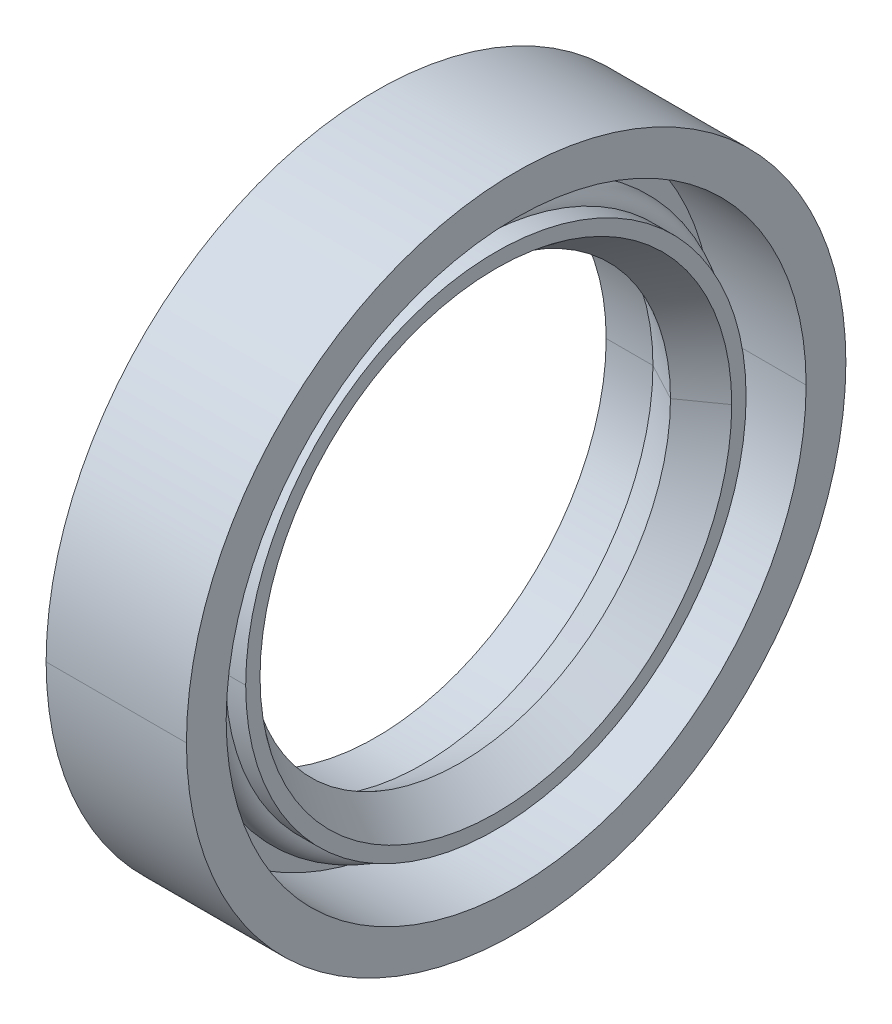
ISO-10303-21;
HEADER;
FILE_DESCRIPTION(('STEP AP214'),'2;1');
FILE_NAME('part.step','',(''),(''),'','','');
FILE_SCHEMA(('AUTOMOTIVE_DESIGN { 1 0 10303 214 1 1 1 1 }'));
ENDSEC;
DATA;
#1=APPLICATION_CONTEXT('core data for automotive mechanical design processes');
#2=APPLICATION_PROTOCOL_DEFINITION('international standard','automotive_design',2000,#1);
#3=PRODUCT_CONTEXT('',#1,'mechanical');
#4=PRODUCT('Part','Part','',(#3));
#5=PRODUCT_RELATED_PRODUCT_CATEGORY('part','',(#4));
#6=PRODUCT_DEFINITION_FORMATION('','',#4);
#7=PRODUCT_DEFINITION_CONTEXT('part definition',#1,'design');
#8=PRODUCT_DEFINITION('design','',#6,#7);
#9=PRODUCT_DEFINITION_SHAPE('','',#8);
#10=(LENGTH_UNIT() NAMED_UNIT(*) SI_UNIT(.MILLI.,.METRE.));
#11=(NAMED_UNIT(*) PLANE_ANGLE_UNIT() SI_UNIT($,.RADIAN.));
#12=(NAMED_UNIT(*) SI_UNIT($,.STERADIAN.) SOLID_ANGLE_UNIT());
#13=UNCERTAINTY_MEASURE_WITH_UNIT(LENGTH_MEASURE(1.E-05),#10,'distance_accuracy_value','');
#14=(GEOMETRIC_REPRESENTATION_CONTEXT(3) GLOBAL_UNCERTAINTY_ASSIGNED_CONTEXT((#13)) GLOBAL_UNIT_ASSIGNED_CONTEXT((#10,
#11,#12)) REPRESENTATION_CONTEXT('',''));
#15=CARTESIAN_POINT('',(0.,0.,0.));
#16=DIRECTION('',(0.,0.,1.));
#17=DIRECTION('',(1.,0.,0.));
#18=AXIS2_PLACEMENT_3D('',#15,#16,#17);
#19=CARTESIAN_POINT('',(10.,0.,0.));
#20=DIRECTION('',(1.,0.,0.));
#21=DIRECTION('',(0.,1.,0.));
#22=AXIS2_PLACEMENT_3D('',#19,#20,#21);
#23=CYLINDRICAL_SURFACE('',#22,23.5);
#24=DIRECTION('',(1.,0.,0.));
#25=VECTOR('',#24,1.);
#26=CARTESIAN_POINT('',(0.,0.,23.5));
#27=LINE('',#26,#25);
#28=CARTESIAN_POINT('',(0.,0.,23.5));
#29=VERTEX_POINT('',#28);
#30=CARTESIAN_POINT('',(10.,0.,23.5));
#31=VERTEX_POINT('',#30);
#32=EDGE_CURVE('E11',#29,#31,#27,.T.);
#33=ORIENTED_EDGE('',*,*,#32,.F.);
#34=CARTESIAN_POINT('',(0.,0.,0.));
#35=DIRECTION('',(1.,0.,0.));
#36=DIRECTION('',(0.,0.,-1.));
#37=AXIS2_PLACEMENT_3D('',#34,#35,#36);
#38=CIRCLE('',#37,23.5);
#39=CARTESIAN_POINT('',(0.,0.,-23.5));
#40=VERTEX_POINT('',#39);
#41=EDGE_CURVE('E25',#29,#40,#38,.T.);
#42=ORIENTED_EDGE('',*,*,#41,.T.);
#43=DIRECTION('',(1.,0.,0.));
#44=VECTOR('',#43,1.);
#45=CARTESIAN_POINT('',(0.,0.,-23.5));
#46=LINE('',#45,#44);
#47=CARTESIAN_POINT('',(10.,0.,-23.5));
#48=VERTEX_POINT('',#47);
#49=EDGE_CURVE('E320',#40,#48,#46,.T.);
#50=ORIENTED_EDGE('',*,*,#49,.T.);
#51=CARTESIAN_POINT('',(10.,0.,0.));
#52=DIRECTION('',(1.,0.,0.));
#53=DIRECTION('',(0.,0.,-1.));
#54=AXIS2_PLACEMENT_3D('',#51,#52,#53);
#55=CIRCLE('',#54,23.5);
#56=EDGE_CURVE('E315',#31,#48,#55,.T.);
#57=ORIENTED_EDGE('',*,*,#56,.F.);
#58=EDGE_LOOP('',(#33,#42,#50,#57));
#59=FACE_BOUND('',#58,.T.);
#60=ADVANCED_FACE('F17',(#59),#23,.T.);
#61=CARTESIAN_POINT('',(10.,20.666666666667,0.));
#62=DIRECTION('',(1.,0.,0.));
#63=DIRECTION('',(0.,0.,-1.));
#64=AXIS2_PLACEMENT_3D('',#61,#62,#63);
#65=PLANE('',#64);
#66=CARTESIAN_POINT('',(10.,0.,0.));
#67=DIRECTION('',(1.,0.,0.));
#68=DIRECTION('',(0.,0.,-1.));
#69=AXIS2_PLACEMENT_3D('',#66,#67,#68);
#70=CIRCLE('',#69,23.5);
#71=EDGE_CURVE('E310',#48,#31,#70,.T.);
#72=ORIENTED_EDGE('',*,*,#71,.T.);
#73=ORIENTED_EDGE('',*,*,#56,.T.);
#74=EDGE_LOOP('',(#72,#73));
#75=FACE_BOUND('',#74,.T.);
#76=CARTESIAN_POINT('',(10.,0.,0.));
#77=DIRECTION('',(1.,0.,0.));
#78=DIRECTION('',(0.,0.,-1.));
#79=AXIS2_PLACEMENT_3D('',#76,#77,#78);
#80=CIRCLE('',#79,20.666666666667);
#81=CARTESIAN_POINT('',(10.,0.,20.666666666667));
#82=VERTEX_POINT('',#81);
#83=CARTESIAN_POINT('',(10.,0.,-20.666666666667));
#84=VERTEX_POINT('',#83);
#85=EDGE_CURVE('E305',#82,#84,#80,.T.);
#86=ORIENTED_EDGE('',*,*,#85,.F.);
#87=CARTESIAN_POINT('',(10.,0.,0.));
#88=DIRECTION('',(1.,0.,0.));
#89=DIRECTION('',(0.,0.,-1.));
#90=AXIS2_PLACEMENT_3D('',#87,#88,#89);
#91=CIRCLE('',#90,20.666666666667);
#92=EDGE_CURVE('E300',#84,#82,#91,.T.);
#93=ORIENTED_EDGE('',*,*,#92,.F.);
#94=EDGE_LOOP('',(#86,#93));
#95=FACE_BOUND('',#94,.T.);
#96=ADVANCED_FACE('F333',(#75,#95),#65,.T.);
#97=CARTESIAN_POINT('',(10.,0.,0.));
#98=DIRECTION('',(1.,0.,0.));
#99=DIRECTION('',(0.,-1.,0.));
#100=AXIS2_PLACEMENT_3D('',#97,#98,#99);
#101=CYLINDRICAL_SURFACE('',#100,20.666666666667);
#102=DIRECTION('',(1.,0.,0.));
#103=VECTOR('',#102,1.);
#104=CARTESIAN_POINT('',(3.3333333333333,0.,20.666666666667));
#105=LINE('',#104,#103);
#106=CARTESIAN_POINT('',(3.3333333333333,0.,20.666666666667));
#107=VERTEX_POINT('',#106);
#108=EDGE_CURVE('E295',#107,#82,#105,.T.);
#109=ORIENTED_EDGE('',*,*,#108,.F.);
#110=CARTESIAN_POINT('',(3.3333333333333,0.,0.));
#111=DIRECTION('',(1.,0.,0.));
#112=DIRECTION('',(0.,0.,-1.));
#113=AXIS2_PLACEMENT_3D('',#110,#111,#112);
#114=CIRCLE('',#113,20.666666666667);
#115=CARTESIAN_POINT('',(3.3333333333333,0.,-20.666666666667));
#116=VERTEX_POINT('',#115);
#117=EDGE_CURVE('E290',#116,#107,#114,.T.);
#118=ORIENTED_EDGE('',*,*,#117,.F.);
#119=DIRECTION('',(1.,0.,0.));
#120=VECTOR('',#119,1.);
#121=CARTESIAN_POINT('',(3.3333333333333,0.,-20.666666666667));
#122=LINE('',#121,#120);
#123=EDGE_CURVE('E285',#116,#84,#122,.T.);
#124=ORIENTED_EDGE('',*,*,#123,.T.);
#125=ORIENTED_EDGE('',*,*,#92,.T.);
#126=EDGE_LOOP('',(#109,#118,#124,#125));
#127=FACE_BOUND('',#126,.T.);
#128=ADVANCED_FACE('F336',(#127),#101,.F.);
#129=CARTESIAN_POINT('',(10.,0.,0.));
#130=DIRECTION('',(1.,0.,0.));
#131=DIRECTION('',(0.,1.,0.));
#132=AXIS2_PLACEMENT_3D('',#129,#130,#131);
#133=CYLINDRICAL_SURFACE('',#132,20.666666666667);
#134=ORIENTED_EDGE('',*,*,#108,.T.);
#135=ORIENTED_EDGE('',*,*,#85,.T.);
#136=ORIENTED_EDGE('',*,*,#123,.F.);
#137=CARTESIAN_POINT('',(3.3333333333333,0.,0.));
#138=DIRECTION('',(1.,0.,0.));
#139=DIRECTION('',(0.,0.,-1.));
#140=AXIS2_PLACEMENT_3D('',#137,#138,#139);
#141=CIRCLE('',#140,20.666666666667);
#142=EDGE_CURVE('E280',#107,#116,#141,.T.);
#143=ORIENTED_EDGE('',*,*,#142,.F.);
#144=EDGE_LOOP('',(#134,#135,#136,#143));
#145=FACE_BOUND('',#144,.T.);
#146=ADVANCED_FACE('F340',(#145),#133,.F.);
#147=CARTESIAN_POINT('',(3.3333333333333,17.833333333333,0.));
#148=DIRECTION('',(1.,0.,0.));
#149=DIRECTION('',(0.,0.,-1.));
#150=AXIS2_PLACEMENT_3D('',#147,#148,#149);
#151=PLANE('',#150);
#152=ORIENTED_EDGE('',*,*,#117,.T.);
#153=ORIENTED_EDGE('',*,*,#142,.T.);
#154=EDGE_LOOP('',(#152,#153));
#155=FACE_BOUND('',#154,.T.);
#156=CARTESIAN_POINT('',(3.3333333333333,0.,0.));
#157=DIRECTION('',(1.,0.,0.));
#158=DIRECTION('',(0.,0.,-1.));
#159=AXIS2_PLACEMENT_3D('',#156,#157,#158);
#160=CIRCLE('',#159,17.833333333333);
#161=CARTESIAN_POINT('',(3.3333333333333,0.,17.833333333333));
#162=VERTEX_POINT('',#161);
#163=CARTESIAN_POINT('',(3.3333333333333,0.,-17.833333333333));
#164=VERTEX_POINT('',#163);
#165=EDGE_CURVE('E275',#162,#164,#160,.T.);
#166=ORIENTED_EDGE('',*,*,#165,.F.);
#167=CARTESIAN_POINT('',(3.3333333333333,0.,0.));
#168=DIRECTION('',(1.,0.,0.));
#169=DIRECTION('',(0.,0.,-1.));
#170=AXIS2_PLACEMENT_3D('',#167,#168,#169);
#171=CIRCLE('',#170,17.833333333333);
#172=EDGE_CURVE('E270',#164,#162,#171,.T.);
#173=ORIENTED_EDGE('',*,*,#172,.F.);
#174=EDGE_LOOP('',(#166,#173));
#175=FACE_BOUND('',#174,.T.);
#176=ADVANCED_FACE('F343',(#155,#175),#151,.T.);
#177=CARTESIAN_POINT('',(10.,0.,0.));
#178=DIRECTION('',(1.,0.,0.));
#179=DIRECTION('',(0.,-1.,0.));
#180=AXIS2_PLACEMENT_3D('',#177,#178,#179);
#181=CYLINDRICAL_SURFACE('',#180,17.833333333333);
#182=DIRECTION('',(1.,0.,0.));
#183=VECTOR('',#182,1.);
#184=CARTESIAN_POINT('',(3.3333333333333,0.,17.833333333333));
#185=LINE('',#184,#183);
#186=CARTESIAN_POINT('',(4.888889,0.,17.833333333333));
#187=VERTEX_POINT('',#186);
#188=EDGE_CURVE('E266',#162,#187,#185,.T.);
#189=ORIENTED_EDGE('',*,*,#188,.T.);
#190=CARTESIAN_POINT('',(4.888889,0.,0.));
#191=DIRECTION('',(1.,0.,0.));
#192=DIRECTION('',(0.,0.,-1.));
#193=AXIS2_PLACEMENT_3D('',#190,#191,#192);
#194=CIRCLE('',#193,17.833333333333);
#195=CARTESIAN_POINT('',(4.888889,16.9605078739299,5.51080306635312));
#196=VERTEX_POINT('',#195);
#197=EDGE_CURVE('E261',#196,#187,#194,.T.);
#198=ORIENTED_EDGE('',*,*,#197,.F.);
#199=CARTESIAN_POINT('',(4.888889,0.,0.));
#200=DIRECTION('',(1.,0.,0.));
#201=DIRECTION('',(0.,0.,-1.));
#202=AXIS2_PLACEMENT_3D('',#199,#200,#201);
#203=CIRCLE('',#202,17.833333333333);
#204=CARTESIAN_POINT('',(4.888889,0.,-17.833333333333));
#205=VERTEX_POINT('',#204);
#206=EDGE_CURVE('E256',#205,#196,#203,.T.);
#207=ORIENTED_EDGE('',*,*,#206,.F.);
#208=DIRECTION('',(1.,0.,0.));
#209=VECTOR('',#208,1.);
#210=CARTESIAN_POINT('',(3.3333333333333,0.,-17.833333333333));
#211=LINE('',#210,#209);
#212=EDGE_CURVE('E251',#164,#205,#211,.T.);
#213=ORIENTED_EDGE('',*,*,#212,.F.);
#214=ORIENTED_EDGE('',*,*,#172,.T.);
#215=EDGE_LOOP('',(#189,#198,#207,#213,#214));
#216=FACE_BOUND('',#215,.T.);
#217=ADVANCED_FACE('F346',(#216),#181,.T.);
#218=CARTESIAN_POINT('',(10.,0.,0.));
#219=DIRECTION('',(1.,0.,0.));
#220=DIRECTION('',(0.,1.,0.));
#221=AXIS2_PLACEMENT_3D('',#218,#219,#220);
#222=CYLINDRICAL_SURFACE('',#221,17.833333333333);
#223=ORIENTED_EDGE('',*,*,#188,.F.);
#224=ORIENTED_EDGE('',*,*,#165,.T.);
#225=ORIENTED_EDGE('',*,*,#212,.T.);
#226=CARTESIAN_POINT('',(4.888889,0.,0.));
#227=DIRECTION('',(1.,0.,0.));
#228=DIRECTION('',(0.,0.,-1.));
#229=AXIS2_PLACEMENT_3D('',#226,#227,#228);
#230=CIRCLE('',#229,17.833333333333);
#231=CARTESIAN_POINT('',(4.888889,-16.9605078739299,-5.51080306635312));
#232=VERTEX_POINT('',#231);
#233=EDGE_CURVE('E246',#232,#205,#230,.T.);
#234=ORIENTED_EDGE('',*,*,#233,.F.);
#235=CARTESIAN_POINT('',(4.888889,0.,0.));
#236=DIRECTION('',(1.,0.,0.));
#237=DIRECTION('',(0.,0.,-1.));
#238=AXIS2_PLACEMENT_3D('',#235,#236,#237);
#239=CIRCLE('',#238,17.833333333333);
#240=EDGE_CURVE('E241',#187,#232,#239,.T.);
#241=ORIENTED_EDGE('',*,*,#240,.F.);
#242=EDGE_LOOP('',(#223,#224,#225,#234,#241));
#243=FACE_BOUND('',#242,.T.);
#244=ADVANCED_FACE('F352',(#243),#222,.T.);
#245=CARTESIAN_POINT('',(6.,0.,0.));
#246=DIRECTION('',(1.,0.,0.));
#247=DIRECTION('',(0.,0.309016994374947,-0.951056516295154));
#248=AXIS2_PLACEMENT_3D('',#245,#246,#247);
#249=TOROIDAL_SURFACE('',#248,17.833333333333,1.111111);
#250=CARTESIAN_POINT('',(6.,-16.9605078739299,-5.51080306635312));
#251=DIRECTION('',(0.,0.309016994374947,-0.951056516295154));
#252=DIRECTION('',(1.,0.,0.));
#253=AXIS2_PLACEMENT_3D('',#250,#251,#252);
#254=CIRCLE('',#253,1.111111);
#255=CARTESIAN_POINT('',(7.111111,-16.9605078739299,-5.51080306635312));
#256=VERTEX_POINT('',#255);
#257=EDGE_CURVE('E236',#256,#232,#254,.T.);
#258=ORIENTED_EDGE('',*,*,#257,.F.);
#259=CARTESIAN_POINT('',(7.111111,0.,0.));
#260=DIRECTION('',(1.,0.,0.));
#261=DIRECTION('',(0.,0.,-1.));
#262=AXIS2_PLACEMENT_3D('',#259,#260,#261);
#263=CIRCLE('',#262,17.833333333333);
#264=CARTESIAN_POINT('',(7.111111,0.,17.833333333333));
#265=VERTEX_POINT('',#264);
#266=EDGE_CURVE('E231',#265,#256,#263,.T.);
#267=ORIENTED_EDGE('',*,*,#266,.F.);
#268=CARTESIAN_POINT('',(7.111111,0.,0.));
#269=DIRECTION('',(1.,0.,0.));
#270=DIRECTION('',(0.,0.,-1.));
#271=AXIS2_PLACEMENT_3D('',#268,#269,#270);
#272=CIRCLE('',#271,17.833333333333);
#273=CARTESIAN_POINT('',(7.111111,16.9605078739299,5.51080306635312));
#274=VERTEX_POINT('',#273);
#275=EDGE_CURVE('E226',#274,#265,#272,.T.);
#276=ORIENTED_EDGE('',*,*,#275,.F.);
#277=CARTESIAN_POINT('',(6.,16.9605078739299,5.51080306635312));
#278=DIRECTION('',(0.,-0.309016994374947,0.951056516295154));
#279=DIRECTION('',(1.,0.,0.));
#280=AXIS2_PLACEMENT_3D('',#277,#278,#279);
#281=CIRCLE('',#280,1.111111);
#282=EDGE_CURVE('E221',#274,#196,#281,.T.);
#283=ORIENTED_EDGE('',*,*,#282,.T.);
#284=ORIENTED_EDGE('',*,*,#197,.T.);
#285=ORIENTED_EDGE('',*,*,#240,.T.);
#286=EDGE_LOOP('',(#258,#267,#276,#283,#284,#285));
#287=FACE_BOUND('',#286,.T.);
#288=ADVANCED_FACE('F359',(#287),#249,.T.);
#289=CARTESIAN_POINT('',(6.,0.,0.));
#290=DIRECTION('',(1.,0.,0.));
#291=DIRECTION('',(0.,-0.309016994374947,0.951056516295154));
#292=AXIS2_PLACEMENT_3D('',#289,#290,#291);
#293=TOROIDAL_SURFACE('',#292,17.833333333333,1.111111);
#294=ORIENTED_EDGE('',*,*,#257,.T.);
#295=ORIENTED_EDGE('',*,*,#233,.T.);
#296=ORIENTED_EDGE('',*,*,#206,.T.);
#297=ORIENTED_EDGE('',*,*,#282,.F.);
#298=CARTESIAN_POINT('',(7.111111,0.,0.));
#299=DIRECTION('',(1.,0.,0.));
#300=DIRECTION('',(0.,0.,-1.));
#301=AXIS2_PLACEMENT_3D('',#298,#299,#300);
#302=CIRCLE('',#301,17.833333333333);
#303=CARTESIAN_POINT('',(7.111111,0.,-17.833333333333));
#304=VERTEX_POINT('',#303);
#305=EDGE_CURVE('E216',#304,#274,#302,.T.);
#306=ORIENTED_EDGE('',*,*,#305,.F.);
#307=CARTESIAN_POINT('',(7.111111,0.,0.));
#308=DIRECTION('',(1.,0.,0.));
#309=DIRECTION('',(0.,0.,-1.));
#310=AXIS2_PLACEMENT_3D('',#307,#308,#309);
#311=CIRCLE('',#310,17.833333333333);
#312=EDGE_CURVE('E211',#256,#304,#311,.T.);
#313=ORIENTED_EDGE('',*,*,#312,.F.);
#314=EDGE_LOOP('',(#294,#295,#296,#297,#306,#313));
#315=FACE_BOUND('',#314,.T.);
#316=ADVANCED_FACE('F355',(#315),#293,.T.);
#317=CARTESIAN_POINT('',(10.,0.,0.));
#318=DIRECTION('',(1.,0.,0.));
#319=DIRECTION('',(0.,1.,0.));
#320=AXIS2_PLACEMENT_3D('',#317,#318,#319);
#321=CYLINDRICAL_SURFACE('',#320,17.833333333333);
#322=DIRECTION('',(1.,0.,0.));
#323=VECTOR('',#322,1.);
#324=CARTESIAN_POINT('',(7.111111,0.,17.833333333333));
#325=LINE('',#324,#323);
#326=CARTESIAN_POINT('',(8.5555555,0.,17.833333333333));
#327=VERTEX_POINT('',#326);
#328=EDGE_CURVE('E206',#265,#327,#325,.T.);
#329=ORIENTED_EDGE('',*,*,#328,.F.);
#330=ORIENTED_EDGE('',*,*,#266,.T.);
#331=ORIENTED_EDGE('',*,*,#312,.T.);
#332=DIRECTION('',(1.,0.,0.));
#333=VECTOR('',#332,1.);
#334=CARTESIAN_POINT('',(7.111111,0.,-17.833333333333));
#335=LINE('',#334,#333);
#336=CARTESIAN_POINT('',(8.5555555,0.,-17.833333333333));
#337=VERTEX_POINT('',#336);
#338=EDGE_CURVE('E202',#304,#337,#335,.T.);
#339=ORIENTED_EDGE('',*,*,#338,.T.);
#340=CARTESIAN_POINT('',(8.5555555,0.,0.));
#341=DIRECTION('',(1.,0.,0.));
#342=DIRECTION('',(0.,0.,-1.));
#343=AXIS2_PLACEMENT_3D('',#340,#341,#342);
#344=CIRCLE('',#343,17.833333333333);
#345=EDGE_CURVE('E197',#327,#337,#344,.T.);
#346=ORIENTED_EDGE('',*,*,#345,.F.);
#347=EDGE_LOOP('',(#329,#330,#331,#339,#346));
#348=FACE_BOUND('',#347,.T.);
#349=ADVANCED_FACE('F364',(#348),#321,.T.);
#350=CARTESIAN_POINT('',(8.5555555,16.810185145833,0.));
#351=DIRECTION('',(1.,0.,0.));
#352=DIRECTION('',(0.,0.,-1.));
#353=AXIS2_PLACEMENT_3D('',#350,#351,#352);
#354=PLANE('',#353);
#355=CARTESIAN_POINT('',(8.5555555,0.,0.));
#356=DIRECTION('',(1.,0.,0.));
#357=DIRECTION('',(0.,0.,-1.));
#358=AXIS2_PLACEMENT_3D('',#355,#356,#357);
#359=CIRCLE('',#358,17.833333333333);
#360=EDGE_CURVE('E192',#337,#327,#359,.T.);
#361=ORIENTED_EDGE('',*,*,#360,.T.);
#362=ORIENTED_EDGE('',*,*,#345,.T.);
#363=EDGE_LOOP('',(#361,#362));
#364=FACE_BOUND('',#363,.T.);
#365=CARTESIAN_POINT('',(8.5555555,0.,0.));
#366=DIRECTION('',(1.,0.,0.));
#367=DIRECTION('',(0.,0.,-1.));
#368=AXIS2_PLACEMENT_3D('',#365,#366,#367);
#369=CIRCLE('',#368,16.810185145833);
#370=CARTESIAN_POINT('',(8.5555555,0.,16.810185145833));
#371=VERTEX_POINT('',#370);
#372=CARTESIAN_POINT('',(8.5555555,0.,-16.810185145833));
#373=VERTEX_POINT('',#372);
#374=EDGE_CURVE('E187',#371,#373,#369,.T.);
#375=ORIENTED_EDGE('',*,*,#374,.F.);
#376=CARTESIAN_POINT('',(8.5555555,0.,0.));
#377=DIRECTION('',(1.,0.,0.));
#378=DIRECTION('',(0.,0.,-1.));
#379=AXIS2_PLACEMENT_3D('',#376,#377,#378);
#380=CIRCLE('',#379,16.810185145833);
#381=EDGE_CURVE('E182',#373,#371,#380,.T.);
#382=ORIENTED_EDGE('',*,*,#381,.F.);
#383=EDGE_LOOP('',(#375,#382));
#384=FACE_BOUND('',#383,.T.);
#385=ADVANCED_FACE('F368',(#364,#384),#354,.T.);
#386=CARTESIAN_POINT('',(6.,0.,0.));
#387=DIRECTION('',(1.,0.,0.));
#388=DIRECTION('',(0.,-1.,0.));
#389=AXIS2_PLACEMENT_3D('',#386,#387,#388);
#390=CONICAL_SURFACE('',#389,15.,0.616296937395985);
#391=DIRECTION('',(0.816024481101705,0.,0.578017340780268));
#392=VECTOR('',#391,1.);
#393=CARTESIAN_POINT('',(6.,0.,15.));
#394=LINE('',#393,#392);
#395=CARTESIAN_POINT('',(6.,0.,15.));
#396=VERTEX_POINT('',#395);
#397=EDGE_CURVE('E177',#396,#371,#394,.T.);
#398=ORIENTED_EDGE('',*,*,#397,.F.);
#399=CARTESIAN_POINT('',(6.,0.,0.));
#400=DIRECTION('',(1.,0.,0.));
#401=DIRECTION('',(0.,0.,-1.));
#402=AXIS2_PLACEMENT_3D('',#399,#400,#401);
#403=CIRCLE('',#402,15.);
#404=CARTESIAN_POINT('',(6.,0.,-15.));
#405=VERTEX_POINT('',#404);
#406=EDGE_CURVE('E172',#405,#396,#403,.T.);
#407=ORIENTED_EDGE('',*,*,#406,.F.);
#408=DIRECTION('',(0.816024481101705,0.,-0.578017340780269));
#409=VECTOR('',#408,1.);
#410=CARTESIAN_POINT('',(6.,0.,-15.));
#411=LINE('',#410,#409);
#412=EDGE_CURVE('E167',#405,#373,#411,.T.);
#413=ORIENTED_EDGE('',*,*,#412,.T.);
#414=ORIENTED_EDGE('',*,*,#381,.T.);
#415=EDGE_LOOP('',(#398,#407,#413,#414));
#416=FACE_BOUND('',#415,.T.);
#417=ADVANCED_FACE('F371',(#416),#390,.F.);
#418=CARTESIAN_POINT('',(6.,0.,0.));
#419=DIRECTION('',(1.,0.,0.));
#420=DIRECTION('',(0.,1.,0.));
#421=AXIS2_PLACEMENT_3D('',#418,#419,#420);
#422=CONICAL_SURFACE('',#421,15.,0.616296937395985);
#423=ORIENTED_EDGE('',*,*,#397,.T.);
#424=ORIENTED_EDGE('',*,*,#374,.T.);
#425=ORIENTED_EDGE('',*,*,#412,.F.);
#426=CARTESIAN_POINT('',(6.,0.,0.));
#427=DIRECTION('',(1.,0.,0.));
#428=DIRECTION('',(0.,0.,-1.));
#429=AXIS2_PLACEMENT_3D('',#426,#427,#428);
#430=CIRCLE('',#429,15.);
#431=EDGE_CURVE('E162',#396,#405,#430,.T.);
#432=ORIENTED_EDGE('',*,*,#431,.F.);
#433=EDGE_LOOP('',(#423,#424,#425,#432));
#434=FACE_BOUND('',#433,.T.);
#435=ADVANCED_FACE('F376',(#434),#422,.F.);
#436=CARTESIAN_POINT('',(3.3333333333333,0.,0.));
#437=DIRECTION('',(-1.,0.,0.));
#438=DIRECTION('',(0.,1.,0.));
#439=AXIS2_PLACEMENT_3D('',#436,#437,#438);
#440=CONICAL_SURFACE('',#439,16.416666666667,0.488333951056498);
#441=DIRECTION('',(-0.883115719457367,0.,-0.469155225961831));
#442=VECTOR('',#441,1.);
#443=CARTESIAN_POINT('',(6.,0.,-15.));
#444=LINE('',#443,#442);
#445=CARTESIAN_POINT('',(3.3333333333333,0.,-16.416666666667));
#446=VERTEX_POINT('',#445);
#447=EDGE_CURVE('E158',#405,#446,#444,.T.);
#448=ORIENTED_EDGE('',*,*,#447,.T.);
#449=CARTESIAN_POINT('',(3.3333333333333,0.,0.));
#450=DIRECTION('',(1.,0.,0.));
#451=DIRECTION('',(0.,0.,-1.));
#452=AXIS2_PLACEMENT_3D('',#449,#450,#451);
#453=CIRCLE('',#452,16.416666666667);
#454=CARTESIAN_POINT('',(3.3333333333333,0.,16.416666666667));
#455=VERTEX_POINT('',#454);
#456=EDGE_CURVE('E129',#455,#446,#453,.T.);
#457=ORIENTED_EDGE('',*,*,#456,.F.);
#458=DIRECTION('',(-0.883115719457367,0.,0.469155225961831));
#459=VECTOR('',#458,1.);
#460=CARTESIAN_POINT('',(6.,0.,15.));
#461=LINE('',#460,#459);
#462=EDGE_CURVE('E150',#396,#455,#461,.T.);
#463=ORIENTED_EDGE('',*,*,#462,.F.);
#464=ORIENTED_EDGE('',*,*,#431,.T.);
#465=EDGE_LOOP('',(#448,#457,#463,#464));
#466=FACE_BOUND('',#465,.T.);
#467=ADVANCED_FACE('F381',(#466),#440,.F.);
#468=CARTESIAN_POINT('',(3.3333333333333,0.,0.));
#469=DIRECTION('',(-1.,0.,0.));
#470=DIRECTION('',(0.,-1.,0.));
#471=AXIS2_PLACEMENT_3D('',#468,#469,#470);
#472=CONICAL_SURFACE('',#471,16.416666666667,0.488333951056498);
#473=ORIENTED_EDGE('',*,*,#447,.F.);
#474=ORIENTED_EDGE('',*,*,#406,.T.);
#475=ORIENTED_EDGE('',*,*,#462,.T.);
#476=CARTESIAN_POINT('',(3.3333333333333,0.,0.));
#477=DIRECTION('',(1.,0.,0.));
#478=DIRECTION('',(0.,0.,-1.));
#479=AXIS2_PLACEMENT_3D('',#476,#477,#478);
#480=CIRCLE('',#479,16.416666666667);
#481=EDGE_CURVE('E146',#446,#455,#480,.T.);
#482=ORIENTED_EDGE('',*,*,#481,.F.);
#483=EDGE_LOOP('',(#473,#474,#475,#482));
#484=FACE_BOUND('',#483,.T.);
#485=ADVANCED_FACE('F384',(#484),#472,.F.);
#486=CARTESIAN_POINT('',(10.,0.,0.));
#487=DIRECTION('',(1.,0.,0.));
#488=DIRECTION('',(0.,-1.,0.));
#489=AXIS2_PLACEMENT_3D('',#486,#487,#488);
#490=CYLINDRICAL_SURFACE('',#489,16.416666666667);
#491=DIRECTION('',(1.,0.,0.));
#492=VECTOR('',#491,1.);
#493=CARTESIAN_POINT('',(0.,0.,16.416666666667));
#494=LINE('',#493,#492);
#495=CARTESIAN_POINT('',(0.,0.,16.416666666667));
#496=VERTEX_POINT('',#495);
#497=EDGE_CURVE('E121',#496,#455,#494,.T.);
#498=ORIENTED_EDGE('',*,*,#497,.F.);
#499=CARTESIAN_POINT('',(0.,0.,0.));
#500=DIRECTION('',(1.,0.,0.));
#501=DIRECTION('',(0.,0.,-1.));
#502=AXIS2_PLACEMENT_3D('',#499,#500,#501);
#503=CIRCLE('',#502,16.416666666667);
#504=CARTESIAN_POINT('',(0.,0.,-16.416666666667));
#505=VERTEX_POINT('',#504);
#506=EDGE_CURVE('E114',#505,#496,#503,.T.);
#507=ORIENTED_EDGE('',*,*,#506,.F.);
#508=DIRECTION('',(1.,0.,0.));
#509=VECTOR('',#508,1.);
#510=CARTESIAN_POINT('',(0.,0.,-16.416666666667));
#511=LINE('',#510,#509);
#512=EDGE_CURVE('E118',#505,#446,#511,.T.);
#513=ORIENTED_EDGE('',*,*,#512,.T.);
#514=ORIENTED_EDGE('',*,*,#481,.T.);
#515=EDGE_LOOP('',(#498,#507,#513,#514));
#516=FACE_BOUND('',#515,.T.);
#517=ADVANCED_FACE('F116',(#516),#490,.F.);
#518=CARTESIAN_POINT('',(10.,0.,0.));
#519=DIRECTION('',(1.,0.,0.));
#520=DIRECTION('',(0.,1.,0.));
#521=AXIS2_PLACEMENT_3D('',#518,#519,#520);
#522=CYLINDRICAL_SURFACE('',#521,16.416666666667);
#523=ORIENTED_EDGE('',*,*,#497,.T.);
#524=ORIENTED_EDGE('',*,*,#456,.T.);
#525=ORIENTED_EDGE('',*,*,#512,.F.);
#526=CARTESIAN_POINT('',(0.,0.,0.));
#527=DIRECTION('',(1.,0.,0.));
#528=DIRECTION('',(0.,0.,-1.));
#529=AXIS2_PLACEMENT_3D('',#526,#527,#528);
#530=CIRCLE('',#529,16.416666666667);
#531=EDGE_CURVE('E128',#496,#505,#530,.T.);
#532=ORIENTED_EDGE('',*,*,#531,.F.);
#533=EDGE_LOOP('',(#523,#524,#525,#532));
#534=FACE_BOUND('',#533,.T.);
#535=ADVANCED_FACE('F127',(#534),#522,.F.);
#536=CARTESIAN_POINT('',(0.,23.5,0.));
#537=DIRECTION('',(-1.,0.,0.));
#538=DIRECTION('',(0.,0.,1.));
#539=AXIS2_PLACEMENT_3D('',#536,#537,#538);
#540=PLANE('',#539);
#541=ORIENTED_EDGE('',*,*,#506,.T.);
#542=ORIENTED_EDGE('',*,*,#531,.T.);
#543=EDGE_LOOP('',(#541,#542));
#544=FACE_BOUND('',#543,.T.);
#545=ORIENTED_EDGE('',*,*,#41,.F.);
#546=CARTESIAN_POINT('',(0.,0.,0.));
#547=DIRECTION('',(1.,0.,0.));
#548=DIRECTION('',(0.,0.,-1.));
#549=AXIS2_PLACEMENT_3D('',#546,#547,#548);
#550=CIRCLE('',#549,23.5);
#551=EDGE_CURVE('E133',#40,#29,#550,.T.);
#552=ORIENTED_EDGE('',*,*,#551,.F.);
#553=EDGE_LOOP('',(#545,#552));
#554=FACE_BOUND('',#553,.T.);
#555=ADVANCED_FACE('F131',(#544,#554),#540,.T.);
#556=CARTESIAN_POINT('',(10.,0.,0.));
#557=DIRECTION('',(1.,0.,0.));
#558=DIRECTION('',(0.,-1.,0.));
#559=AXIS2_PLACEMENT_3D('',#556,#557,#558);
#560=CYLINDRICAL_SURFACE('',#559,23.5);
#561=ORIENTED_EDGE('',*,*,#32,.T.);
#562=ORIENTED_EDGE('',*,*,#71,.F.);
#563=ORIENTED_EDGE('',*,*,#49,.F.);
#564=ORIENTED_EDGE('',*,*,#551,.T.);
#565=EDGE_LOOP('',(#561,#562,#563,#564));
#566=FACE_BOUND('',#565,.T.);
#567=ADVANCED_FACE('F331',(#566),#560,.T.);
#568=CARTESIAN_POINT('',(10.,0.,0.));
#569=DIRECTION('',(1.,0.,0.));
#570=DIRECTION('',(0.,-1.,0.));
#571=AXIS2_PLACEMENT_3D('',#568,#569,#570);
#572=CYLINDRICAL_SURFACE('',#571,17.833333333333);
#573=ORIENTED_EDGE('',*,*,#328,.T.);
#574=ORIENTED_EDGE('',*,*,#360,.F.);
#575=ORIENTED_EDGE('',*,*,#338,.F.);
#576=ORIENTED_EDGE('',*,*,#305,.T.);
#577=ORIENTED_EDGE('',*,*,#275,.T.);
#578=EDGE_LOOP('',(#573,#574,#575,#576,#577));
#579=FACE_BOUND('',#578,.T.);
#580=ADVANCED_FACE('F366',(#579),#572,.T.);
#581=CLOSED_SHELL('',(#60,#96,#128,#146,#176,#217,#244,#288,#316,#349,#385,#417,#435,#467,#485,
#517,#535,#555,#567,#580));
#582=MANIFOLD_SOLID_BREP('B1',#581);
#583=ADVANCED_BREP_SHAPE_REPRESENTATION('',(#18,#582),#14);
#584=SHAPE_DEFINITION_REPRESENTATION(#9,#583);
ENDSEC;
END-ISO-10303-21;
